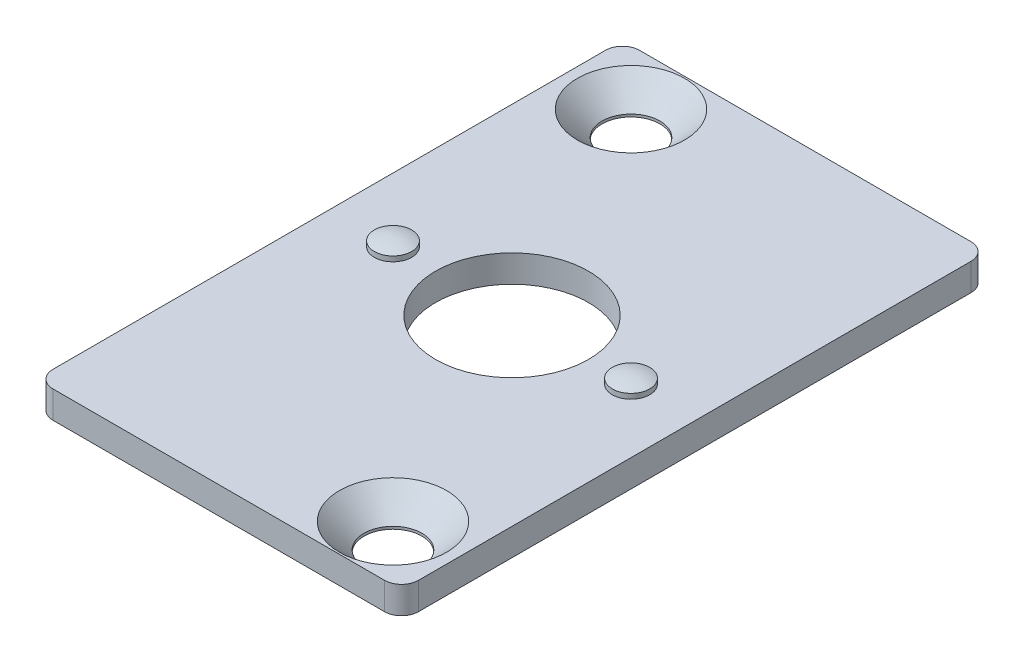
ISO-10303-21;
HEADER;
FILE_DESCRIPTION(('STEP AP214'),'2;1');
FILE_NAME('part.step','',(''),(''),'','','');
FILE_SCHEMA(('AUTOMOTIVE_DESIGN { 1 0 10303 214 1 1 1 1 }'));
ENDSEC;
DATA;
#1=APPLICATION_CONTEXT('core data for automotive mechanical design processes');
#2=APPLICATION_PROTOCOL_DEFINITION('international standard','automotive_design',2000,#1);
#3=PRODUCT_CONTEXT('',#1,'mechanical');
#4=PRODUCT('Part','Part','',(#3));
#5=PRODUCT_RELATED_PRODUCT_CATEGORY('part','',(#4));
#6=PRODUCT_DEFINITION_FORMATION('','',#4);
#7=PRODUCT_DEFINITION_CONTEXT('part definition',#1,'design');
#8=PRODUCT_DEFINITION('design','',#6,#7);
#9=PRODUCT_DEFINITION_SHAPE('','',#8);
#10=(LENGTH_UNIT() NAMED_UNIT(*) SI_UNIT(.MILLI.,.METRE.));
#11=(NAMED_UNIT(*) PLANE_ANGLE_UNIT() SI_UNIT($,.RADIAN.));
#12=(NAMED_UNIT(*) SI_UNIT($,.STERADIAN.) SOLID_ANGLE_UNIT());
#13=UNCERTAINTY_MEASURE_WITH_UNIT(LENGTH_MEASURE(1.E-05),#10,'distance_accuracy_value','');
#14=(GEOMETRIC_REPRESENTATION_CONTEXT(3) GLOBAL_UNCERTAINTY_ASSIGNED_CONTEXT((#13)) GLOBAL_UNIT_ASSIGNED_CONTEXT((#10,
#11,#12)) REPRESENTATION_CONTEXT('',''));
#15=CARTESIAN_POINT('',(0.,0.,0.));
#16=DIRECTION('',(0.,0.,1.));
#17=DIRECTION('',(1.,0.,0.));
#18=AXIS2_PLACEMENT_3D('',#15,#16,#17);
#19=CARTESIAN_POINT('',(10.75,-1.6,-17.25));
#20=DIRECTION('',(1.,0.,0.));
#21=DIRECTION('',(0.,0.,-1.));
#22=AXIS2_PLACEMENT_3D('',#19,#20,#21);
#23=PLANE('',#22);
#24=DIRECTION('',(0.,0.,-1.));
#25=VECTOR('',#24,1.);
#26=CARTESIAN_POINT('',(10.75,-1.6,-17.25));
#27=LINE('',#26,#25);
#28=CARTESIAN_POINT('',(10.75,-1.6,16.25));
#29=VERTEX_POINT('',#28);
#30=CARTESIAN_POINT('',(10.75,-1.6,-16.25));
#31=VERTEX_POINT('',#30);
#32=EDGE_CURVE('E155',#29,#31,#27,.T.);
#33=ORIENTED_EDGE('',*,*,#32,.T.);
#34=DIRECTION('',(0.,1.,0.));
#35=VECTOR('',#34,1.);
#36=CARTESIAN_POINT('',(10.75,-1.6,-16.25));
#37=LINE('',#36,#35);
#38=CARTESIAN_POINT('',(10.75,0.,-16.25));
#39=VERTEX_POINT('',#38);
#40=EDGE_CURVE('E151',#31,#39,#37,.T.);
#41=ORIENTED_EDGE('',*,*,#40,.T.);
#42=DIRECTION('',(0.,0.,-1.));
#43=VECTOR('',#42,1.);
#44=CARTESIAN_POINT('',(10.75,0.,-17.25));
#45=LINE('',#44,#43);
#46=CARTESIAN_POINT('',(10.75,0.,16.25));
#47=VERTEX_POINT('',#46);
#48=EDGE_CURVE('E104',#47,#39,#45,.T.);
#49=ORIENTED_EDGE('',*,*,#48,.F.);
#50=DIRECTION('',(0.,1.,0.));
#51=VECTOR('',#50,1.);
#52=CARTESIAN_POINT('',(10.75,-1.6,16.25));
#53=LINE('',#52,#51);
#54=EDGE_CURVE('E149',#47,#29,#53,.F.);
#55=ORIENTED_EDGE('',*,*,#54,.T.);
#56=EDGE_LOOP('',(#33,#41,#49,#55));
#57=FACE_BOUND('',#56,.T.);
#58=ADVANCED_FACE('F33',(#57),#23,.T.);
#59=CARTESIAN_POINT('',(-10.75,-1.6,17.25));
#60=DIRECTION('',(0.,0.,1.));
#61=DIRECTION('',(1.,0.,0.));
#62=AXIS2_PLACEMENT_3D('',#59,#60,#61);
#63=PLANE('',#62);
#64=DIRECTION('',(1.,0.,0.));
#65=VECTOR('',#64,1.);
#66=CARTESIAN_POINT('',(-10.75,-1.6,17.25));
#67=LINE('',#66,#65);
#68=CARTESIAN_POINT('',(-9.75,-1.6,17.25));
#69=VERTEX_POINT('',#68);
#70=CARTESIAN_POINT('',(9.75,-1.6,17.25));
#71=VERTEX_POINT('',#70);
#72=EDGE_CURVE('E130',#69,#71,#67,.T.);
#73=ORIENTED_EDGE('',*,*,#72,.T.);
#74=DIRECTION('',(0.,1.,0.));
#75=VECTOR('',#74,1.);
#76=CARTESIAN_POINT('',(9.75,-1.6,17.25));
#77=LINE('',#76,#75);
#78=CARTESIAN_POINT('',(9.75,0.,17.25));
#79=VERTEX_POINT('',#78);
#80=EDGE_CURVE('E11',#71,#79,#77,.T.);
#81=ORIENTED_EDGE('',*,*,#80,.T.);
#82=DIRECTION('',(1.,0.,0.));
#83=VECTOR('',#82,1.);
#84=CARTESIAN_POINT('',(-10.75,0.,17.25));
#85=LINE('',#84,#83);
#86=CARTESIAN_POINT('',(-9.75,0.,17.25));
#87=VERTEX_POINT('',#86);
#88=EDGE_CURVE('E157',#87,#79,#85,.T.);
#89=ORIENTED_EDGE('',*,*,#88,.F.);
#90=DIRECTION('',(0.,1.,0.));
#91=VECTOR('',#90,1.);
#92=CARTESIAN_POINT('',(-9.75,-1.6,17.25));
#93=LINE('',#92,#91);
#94=EDGE_CURVE('E41',#87,#69,#93,.F.);
#95=ORIENTED_EDGE('',*,*,#94,.T.);
#96=EDGE_LOOP('',(#73,#81,#89,#95));
#97=FACE_BOUND('',#96,.T.);
#98=ADVANCED_FACE('F228',(#97),#63,.T.);
#99=CARTESIAN_POINT('',(-10.75,-1.6,-17.25));
#100=DIRECTION('',(-1.,0.,0.));
#101=DIRECTION('',(0.,0.,1.));
#102=AXIS2_PLACEMENT_3D('',#99,#100,#101);
#103=PLANE('',#102);
#104=DIRECTION('',(0.,0.,1.));
#105=VECTOR('',#104,1.);
#106=CARTESIAN_POINT('',(-10.75,0.,-17.25));
#107=LINE('',#106,#105);
#108=CARTESIAN_POINT('',(-10.75,0.,-16.25));
#109=VERTEX_POINT('',#108);
#110=CARTESIAN_POINT('',(-10.75,0.,16.25));
#111=VERTEX_POINT('',#110);
#112=EDGE_CURVE('E120',#109,#111,#107,.T.);
#113=ORIENTED_EDGE('',*,*,#112,.F.);
#114=DIRECTION('',(0.,1.,0.));
#115=VECTOR('',#114,1.);
#116=CARTESIAN_POINT('',(-10.75,-1.6,-16.25));
#117=LINE('',#116,#115);
#118=CARTESIAN_POINT('',(-10.75,-1.6,-16.25));
#119=VERTEX_POINT('',#118);
#120=EDGE_CURVE('E141',#109,#119,#117,.F.);
#121=ORIENTED_EDGE('',*,*,#120,.T.);
#122=DIRECTION('',(0.,0.,1.));
#123=VECTOR('',#122,1.);
#124=CARTESIAN_POINT('',(-10.75,-1.6,-17.25));
#125=LINE('',#124,#123);
#126=CARTESIAN_POINT('',(-10.75,-1.6,16.25));
#127=VERTEX_POINT('',#126);
#128=EDGE_CURVE('E159',#119,#127,#125,.T.);
#129=ORIENTED_EDGE('',*,*,#128,.T.);
#130=DIRECTION('',(0.,1.,0.));
#131=VECTOR('',#130,1.);
#132=CARTESIAN_POINT('',(-10.75,-1.6,16.25));
#133=LINE('',#132,#131);
#134=EDGE_CURVE('E138',#127,#111,#133,.T.);
#135=ORIENTED_EDGE('',*,*,#134,.T.);
#136=EDGE_LOOP('',(#113,#121,#129,#135));
#137=FACE_BOUND('',#136,.T.);
#138=ADVANCED_FACE('F233',(#137),#103,.T.);
#139=CARTESIAN_POINT('',(-10.75,-1.6,-17.25));
#140=DIRECTION('',(0.,0.,-1.));
#141=DIRECTION('',(-1.,0.,0.));
#142=AXIS2_PLACEMENT_3D('',#139,#140,#141);
#143=PLANE('',#142);
#144=DIRECTION('',(-1.,0.,0.));
#145=VECTOR('',#144,1.);
#146=CARTESIAN_POINT('',(-10.75,-1.6,-17.25));
#147=LINE('',#146,#145);
#148=CARTESIAN_POINT('',(9.75,-1.6,-17.25));
#149=VERTEX_POINT('',#148);
#150=CARTESIAN_POINT('',(-9.75,-1.6,-17.25));
#151=VERTEX_POINT('',#150);
#152=EDGE_CURVE('E156',#149,#151,#147,.T.);
#153=ORIENTED_EDGE('',*,*,#152,.T.);
#154=DIRECTION('',(0.,1.,0.));
#155=VECTOR('',#154,1.);
#156=CARTESIAN_POINT('',(-9.75,-1.6,-17.25));
#157=LINE('',#156,#155);
#158=CARTESIAN_POINT('',(-9.75,0.,-17.25));
#159=VERTEX_POINT('',#158);
#160=EDGE_CURVE('E119',#151,#159,#157,.T.);
#161=ORIENTED_EDGE('',*,*,#160,.T.);
#162=DIRECTION('',(-1.,0.,0.));
#163=VECTOR('',#162,1.);
#164=CARTESIAN_POINT('',(-10.75,0.,-17.25));
#165=LINE('',#164,#163);
#166=CARTESIAN_POINT('',(9.75,0.,-17.25));
#167=VERTEX_POINT('',#166);
#168=EDGE_CURVE('E102',#167,#159,#165,.T.);
#169=ORIENTED_EDGE('',*,*,#168,.F.);
#170=DIRECTION('',(0.,1.,0.));
#171=VECTOR('',#170,1.);
#172=CARTESIAN_POINT('',(9.75,-1.6,-17.25));
#173=LINE('',#172,#171);
#174=EDGE_CURVE('E116',#167,#149,#173,.F.);
#175=ORIENTED_EDGE('',*,*,#174,.T.);
#176=EDGE_LOOP('',(#153,#161,#169,#175));
#177=FACE_BOUND('',#176,.T.);
#178=ADVANCED_FACE('F115',(#177),#143,.T.);
#179=CARTESIAN_POINT('',(0.,-1.6,0.));
#180=DIRECTION('',(0.,1.,0.));
#181=DIRECTION('',(0.,0.,1.));
#182=AXIS2_PLACEMENT_3D('',#179,#180,#181);
#183=PLANE('',#182);
#184=CARTESIAN_POINT('',(-7.,-1.6,0.));
#185=DIRECTION('',(0.,-1.,0.));
#186=DIRECTION('',(0.,0.,-1.));
#187=AXIS2_PLACEMENT_3D('',#184,#185,#186);
#188=CIRCLE('',#187,1.1);
#189=CARTESIAN_POINT('',(-7.,-1.6,-1.1));
#190=VERTEX_POINT('',#189);
#191=EDGE_CURVE('E454',#190,#190,#188,.T.);
#192=ORIENTED_EDGE('',*,*,#191,.F.);
#193=EDGE_LOOP('',(#192));
#194=FACE_BOUND('',#193,.T.);
#195=CARTESIAN_POINT('',(7.,-1.6,0.));
#196=DIRECTION('',(0.,-1.,0.));
#197=DIRECTION('',(0.,0.,-1.));
#198=AXIS2_PLACEMENT_3D('',#195,#196,#197);
#199=CIRCLE('',#198,1.1);
#200=CARTESIAN_POINT('',(7.,-1.6,-1.1));
#201=VERTEX_POINT('',#200);
#202=EDGE_CURVE('E198',#201,#201,#199,.T.);
#203=ORIENTED_EDGE('',*,*,#202,.F.);
#204=EDGE_LOOP('',(#203));
#205=FACE_BOUND('',#204,.T.);
#206=CARTESIAN_POINT('',(0.,-1.6,0.));
#207=DIRECTION('',(0.,1.,0.));
#208=DIRECTION('',(0.,0.,1.));
#209=AXIS2_PLACEMENT_3D('',#206,#207,#208);
#210=CIRCLE('',#209,4.5);
#211=CARTESIAN_POINT('',(0.,-1.6,4.5));
#212=VERTEX_POINT('',#211);
#213=EDGE_CURVE('E188',#212,#212,#210,.T.);
#214=ORIENTED_EDGE('',*,*,#213,.T.);
#215=EDGE_LOOP('',(#214));
#216=FACE_BOUND('',#215,.T.);
#217=CARTESIAN_POINT('',(-7.,-1.6,-14.));
#218=DIRECTION('',(0.,1.,0.));
#219=DIRECTION('',(0.,0.,1.));
#220=AXIS2_PLACEMENT_3D('',#217,#218,#219);
#221=CIRCLE('',#220,1.7);
#222=CARTESIAN_POINT('',(-7.,-1.6,-12.3));
#223=VERTEX_POINT('',#222);
#224=EDGE_CURVE('E176',#223,#223,#221,.T.);
#225=ORIENTED_EDGE('',*,*,#224,.T.);
#226=EDGE_LOOP('',(#225));
#227=FACE_BOUND('',#226,.T.);
#228=CARTESIAN_POINT('',(7.,-1.6,14.));
#229=DIRECTION('',(0.,1.,0.));
#230=DIRECTION('',(0.,0.,1.));
#231=AXIS2_PLACEMENT_3D('',#228,#229,#230);
#232=CIRCLE('',#231,1.7);
#233=CARTESIAN_POINT('',(7.,-1.6,15.7));
#234=VERTEX_POINT('',#233);
#235=EDGE_CURVE('E170',#234,#234,#232,.T.);
#236=ORIENTED_EDGE('',*,*,#235,.T.);
#237=EDGE_LOOP('',(#236));
#238=FACE_BOUND('',#237,.T.);
#239=ORIENTED_EDGE('',*,*,#128,.F.);
#240=CARTESIAN_POINT('',(-9.75,-1.6,-16.25));
#241=DIRECTION('',(0.,1.,0.));
#242=DIRECTION('',(0.,0.,1.));
#243=AXIS2_PLACEMENT_3D('',#240,#241,#242);
#244=CIRCLE('',#243,1.);
#245=EDGE_CURVE('E147',#119,#151,#244,.F.);
#246=ORIENTED_EDGE('',*,*,#245,.T.);
#247=ORIENTED_EDGE('',*,*,#152,.F.);
#248=CARTESIAN_POINT('',(9.75,-1.6,-16.25));
#249=DIRECTION('',(0.,1.,0.));
#250=DIRECTION('',(0.,0.,1.));
#251=AXIS2_PLACEMENT_3D('',#248,#249,#250);
#252=CIRCLE('',#251,1.);
#253=EDGE_CURVE('E124',#149,#31,#252,.F.);
#254=ORIENTED_EDGE('',*,*,#253,.T.);
#255=ORIENTED_EDGE('',*,*,#32,.F.);
#256=CARTESIAN_POINT('',(9.75,-1.6,16.25));
#257=DIRECTION('',(0.,1.,0.));
#258=DIRECTION('',(0.,0.,1.));
#259=AXIS2_PLACEMENT_3D('',#256,#257,#258);
#260=CIRCLE('',#259,1.);
#261=EDGE_CURVE('E48',#29,#71,#260,.F.);
#262=ORIENTED_EDGE('',*,*,#261,.T.);
#263=ORIENTED_EDGE('',*,*,#72,.F.);
#264=CARTESIAN_POINT('',(-9.75,-1.6,16.25));
#265=DIRECTION('',(0.,1.,0.));
#266=DIRECTION('',(0.,0.,1.));
#267=AXIS2_PLACEMENT_3D('',#264,#265,#266);
#268=CIRCLE('',#267,1.);
#269=EDGE_CURVE('E143',#69,#127,#268,.F.);
#270=ORIENTED_EDGE('',*,*,#269,.T.);
#271=EDGE_LOOP('',(#239,#246,#247,#254,#255,#262,#263,#270));
#272=FACE_BOUND('',#271,.T.);
#273=ADVANCED_FACE('F269',(#194,#205,#216,#227,#238,#272),#183,.F.);
#274=CARTESIAN_POINT('',(0.,0.,0.));
#275=DIRECTION('',(0.,1.,0.));
#276=DIRECTION('',(0.,0.,1.));
#277=AXIS2_PLACEMENT_3D('',#274,#275,#276);
#278=PLANE('',#277);
#279=CARTESIAN_POINT('',(7.,0.,0.));
#280=DIRECTION('',(0.,1.,0.));
#281=DIRECTION('',(0.,0.,1.));
#282=AXIS2_PLACEMENT_3D('',#279,#280,#281);
#283=CIRCLE('',#282,1.1);
#284=CARTESIAN_POINT('',(7.,0.,1.1));
#285=VERTEX_POINT('',#284);
#286=EDGE_CURVE('E125',#285,#285,#283,.T.);
#287=ORIENTED_EDGE('',*,*,#286,.F.);
#288=EDGE_LOOP('',(#287));
#289=FACE_BOUND('',#288,.T.);
#290=CARTESIAN_POINT('',(-7.,0.,0.));
#291=DIRECTION('',(0.,1.,0.));
#292=DIRECTION('',(0.,0.,1.));
#293=AXIS2_PLACEMENT_3D('',#290,#291,#292);
#294=CIRCLE('',#293,1.1);
#295=CARTESIAN_POINT('',(-7.,0.,1.1));
#296=VERTEX_POINT('',#295);
#297=EDGE_CURVE('E184',#296,#296,#294,.T.);
#298=ORIENTED_EDGE('',*,*,#297,.F.);
#299=EDGE_LOOP('',(#298));
#300=FACE_BOUND('',#299,.T.);
#301=CARTESIAN_POINT('',(0.,0.,0.));
#302=DIRECTION('',(0.,1.,0.));
#303=DIRECTION('',(0.,0.,1.));
#304=AXIS2_PLACEMENT_3D('',#301,#302,#303);
#305=CIRCLE('',#304,4.5);
#306=CARTESIAN_POINT('',(0.,0.,4.5));
#307=VERTEX_POINT('',#306);
#308=EDGE_CURVE('E183',#307,#307,#305,.T.);
#309=ORIENTED_EDGE('',*,*,#308,.F.);
#310=EDGE_LOOP('',(#309));
#311=FACE_BOUND('',#310,.T.);
#312=CARTESIAN_POINT('',(-7.,0.,-14.));
#313=DIRECTION('',(0.,1.,0.));
#314=DIRECTION('',(0.,0.,1.));
#315=AXIS2_PLACEMENT_3D('',#312,#313,#314);
#316=CIRCLE('',#315,3.15);
#317=CARTESIAN_POINT('',(-7.,0.,-10.85));
#318=VERTEX_POINT('',#317);
#319=EDGE_CURVE('E201',#318,#318,#316,.T.);
#320=ORIENTED_EDGE('',*,*,#319,.F.);
#321=EDGE_LOOP('',(#320));
#322=FACE_BOUND('',#321,.T.);
#323=CARTESIAN_POINT('',(7.,0.,14.));
#324=DIRECTION('',(0.,1.,0.));
#325=DIRECTION('',(0.,0.,1.));
#326=AXIS2_PLACEMENT_3D('',#323,#324,#325);
#327=CIRCLE('',#326,3.15);
#328=CARTESIAN_POINT('',(7.,0.,17.15));
#329=VERTEX_POINT('',#328);
#330=EDGE_CURVE('E179',#329,#329,#327,.T.);
#331=ORIENTED_EDGE('',*,*,#330,.F.);
#332=EDGE_LOOP('',(#331));
#333=FACE_BOUND('',#332,.T.);
#334=ORIENTED_EDGE('',*,*,#168,.T.);
#335=CARTESIAN_POINT('',(-9.75,0.,-16.25));
#336=DIRECTION('',(0.,1.,0.));
#337=DIRECTION('',(0.,0.,1.));
#338=AXIS2_PLACEMENT_3D('',#335,#336,#337);
#339=CIRCLE('',#338,1.);
#340=EDGE_CURVE('E109',#159,#109,#339,.T.);
#341=ORIENTED_EDGE('',*,*,#340,.T.);
#342=ORIENTED_EDGE('',*,*,#112,.T.);
#343=CARTESIAN_POINT('',(-9.75,0.,16.25));
#344=DIRECTION('',(0.,1.,0.));
#345=DIRECTION('',(0.,0.,1.));
#346=AXIS2_PLACEMENT_3D('',#343,#344,#345);
#347=CIRCLE('',#346,1.);
#348=EDGE_CURVE('E127',#111,#87,#347,.T.);
#349=ORIENTED_EDGE('',*,*,#348,.T.);
#350=ORIENTED_EDGE('',*,*,#88,.T.);
#351=CARTESIAN_POINT('',(9.75,0.,16.25));
#352=DIRECTION('',(0.,1.,0.));
#353=DIRECTION('',(0.,0.,1.));
#354=AXIS2_PLACEMENT_3D('',#351,#352,#353);
#355=CIRCLE('',#354,1.);
#356=EDGE_CURVE('E110',#79,#47,#355,.T.);
#357=ORIENTED_EDGE('',*,*,#356,.T.);
#358=ORIENTED_EDGE('',*,*,#48,.T.);
#359=CARTESIAN_POINT('',(9.75,0.,-16.25));
#360=DIRECTION('',(0.,1.,0.));
#361=DIRECTION('',(0.,0.,1.));
#362=AXIS2_PLACEMENT_3D('',#359,#360,#361);
#363=CIRCLE('',#362,1.);
#364=EDGE_CURVE('E99',#39,#167,#363,.T.);
#365=ORIENTED_EDGE('',*,*,#364,.T.);
#366=EDGE_LOOP('',(#334,#341,#342,#349,#350,#357,#358,#365));
#367=FACE_BOUND('',#366,.T.);
#368=ADVANCED_FACE('F101',(#289,#300,#311,#322,#333,#367),#278,.T.);
#369=CARTESIAN_POINT('',(7.,0.,14.));
#370=DIRECTION('',(0.,1.,0.));
#371=DIRECTION('',(0.,0.,1.));
#372=AXIS2_PLACEMENT_3D('',#369,#370,#371);
#373=CYLINDRICAL_SURFACE('',#372,1.7);
#374=CARTESIAN_POINT('',(7.,-1.45,14.));
#375=DIRECTION('',(0.,1.,0.));
#376=DIRECTION('',(0.,0.,1.));
#377=AXIS2_PLACEMENT_3D('',#374,#375,#376);
#378=CIRCLE('',#377,1.7);
#379=CARTESIAN_POINT('',(7.,-1.45,15.7));
#380=VERTEX_POINT('',#379);
#381=EDGE_CURVE('E164',#380,#380,#378,.T.);
#382=ORIENTED_EDGE('',*,*,#381,.T.);
#383=EDGE_LOOP('',(#382));
#384=FACE_BOUND('',#383,.T.);
#385=ORIENTED_EDGE('',*,*,#235,.F.);
#386=EDGE_LOOP('',(#385));
#387=FACE_BOUND('',#386,.T.);
#388=ADVANCED_FACE('F212',(#384,#387),#373,.F.);
#389=CARTESIAN_POINT('',(7.,0.,14.));
#390=DIRECTION('',(0.,1.,0.));
#391=DIRECTION('',(0.,0.,1.));
#392=AXIS2_PLACEMENT_3D('',#389,#390,#391);
#393=CONICAL_SURFACE('',#392,3.15,0.785398163397448);
#394=ORIENTED_EDGE('',*,*,#381,.F.);
#395=EDGE_LOOP('',(#394));
#396=FACE_BOUND('',#395,.T.);
#397=ORIENTED_EDGE('',*,*,#330,.T.);
#398=EDGE_LOOP('',(#397));
#399=FACE_BOUND('',#398,.T.);
#400=ADVANCED_FACE('F215',(#396,#399),#393,.F.);
#401=CARTESIAN_POINT('',(-7.,0.,-14.));
#402=DIRECTION('',(0.,1.,0.));
#403=DIRECTION('',(0.,0.,1.));
#404=AXIS2_PLACEMENT_3D('',#401,#402,#403);
#405=CYLINDRICAL_SURFACE('',#404,1.7);
#406=CARTESIAN_POINT('',(-7.,-1.45,-14.));
#407=DIRECTION('',(0.,1.,0.));
#408=DIRECTION('',(0.,0.,1.));
#409=AXIS2_PLACEMENT_3D('',#406,#407,#408);
#410=CIRCLE('',#409,1.7);
#411=CARTESIAN_POINT('',(-7.,-1.45,-12.3));
#412=VERTEX_POINT('',#411);
#413=EDGE_CURVE('E180',#412,#412,#410,.T.);
#414=ORIENTED_EDGE('',*,*,#413,.T.);
#415=EDGE_LOOP('',(#414));
#416=FACE_BOUND('',#415,.T.);
#417=ORIENTED_EDGE('',*,*,#224,.F.);
#418=EDGE_LOOP('',(#417));
#419=FACE_BOUND('',#418,.T.);
#420=ADVANCED_FACE('F217',(#416,#419),#405,.F.);
#421=CARTESIAN_POINT('',(-7.,0.,-14.));
#422=DIRECTION('',(0.,1.,0.));
#423=DIRECTION('',(0.,0.,1.));
#424=AXIS2_PLACEMENT_3D('',#421,#422,#423);
#425=CONICAL_SURFACE('',#424,3.15,0.785398163397448);
#426=ORIENTED_EDGE('',*,*,#413,.F.);
#427=EDGE_LOOP('',(#426));
#428=FACE_BOUND('',#427,.T.);
#429=ORIENTED_EDGE('',*,*,#319,.T.);
#430=EDGE_LOOP('',(#429));
#431=FACE_BOUND('',#430,.T.);
#432=ADVANCED_FACE('F223',(#428,#431),#425,.F.);
#433=CARTESIAN_POINT('',(0.,-1.6,0.));
#434=DIRECTION('',(0.,1.,0.));
#435=DIRECTION('',(0.,0.,1.));
#436=AXIS2_PLACEMENT_3D('',#433,#434,#435);
#437=CYLINDRICAL_SURFACE('',#436,4.5);
#438=ORIENTED_EDGE('',*,*,#213,.F.);
#439=EDGE_LOOP('',(#438));
#440=FACE_BOUND('',#439,.T.);
#441=ORIENTED_EDGE('',*,*,#308,.T.);
#442=EDGE_LOOP('',(#441));
#443=FACE_BOUND('',#442,.T.);
#444=ADVANCED_FACE('F376',(#440,#443),#437,.F.);
#445=CARTESIAN_POINT('',(-7.,0.3,0.));
#446=DIRECTION('',(0.,-1.,0.));
#447=DIRECTION('',(0.,0.,-1.));
#448=AXIS2_PLACEMENT_3D('',#445,#446,#447);
#449=CYLINDRICAL_SURFACE('',#448,1.1);
#450=CARTESIAN_POINT('',(-7.,0.3,0.));
#451=DIRECTION('',(0.,1.,0.));
#452=DIRECTION('',(0.,0.,1.));
#453=AXIS2_PLACEMENT_3D('',#450,#451,#452);
#454=CIRCLE('',#453,1.1);
#455=CARTESIAN_POINT('',(-7.,0.3,1.1));
#456=VERTEX_POINT('',#455);
#457=EDGE_CURVE('E181',#456,#456,#454,.T.);
#458=ORIENTED_EDGE('',*,*,#457,.F.);
#459=EDGE_LOOP('',(#458));
#460=FACE_BOUND('',#459,.T.);
#461=ORIENTED_EDGE('',*,*,#297,.T.);
#462=EDGE_LOOP('',(#461));
#463=FACE_BOUND('',#462,.T.);
#464=ADVANCED_FACE('F242',(#460,#463),#449,.T.);
#465=CARTESIAN_POINT('',(-7.,-2.625,0.));
#466=DIRECTION('',(0.,0.,1.));
#467=DIRECTION('',(1.,0.,0.));
#468=AXIS2_PLACEMENT_3D('',#465,#466,#467);
#469=SPHERICAL_SURFACE('',#468,3.125);
#470=CARTESIAN_POINT('',(-7.,-2.625,0.));
#471=DIRECTION('',(0.,1.,0.));
#472=DIRECTION('',(0.,0.,1.));
#473=AXIS2_PLACEMENT_3D('',#470,#471,#472);
#474=SPHERICAL_SURFACE('',#473,3.125);
#475=ORIENTED_EDGE('',*,*,#457,.T.);
#476=EDGE_LOOP('',(#475));
#477=FACE_BOUND('',#476,.T.);
#478=ADVANCED_FACE('F238',(#477),#474,.T.);
#479=CARTESIAN_POINT('',(7.,0.3,0.));
#480=DIRECTION('',(0.,-1.,0.));
#481=DIRECTION('',(0.,0.,-1.));
#482=AXIS2_PLACEMENT_3D('',#479,#480,#481);
#483=CYLINDRICAL_SURFACE('',#482,1.1);
#484=CARTESIAN_POINT('',(7.,0.3,0.));
#485=DIRECTION('',(0.,-1.,0.));
#486=DIRECTION('',(0.,0.,1.));
#487=AXIS2_PLACEMENT_3D('',#484,#485,#486);
#488=CIRCLE('',#487,1.1);
#489=CARTESIAN_POINT('',(7.,0.3,1.1));
#490=VERTEX_POINT('',#489);
#491=EDGE_CURVE('E133',#490,#490,#488,.T.);
#492=ORIENTED_EDGE('',*,*,#491,.T.);
#493=EDGE_LOOP('',(#492));
#494=FACE_BOUND('',#493,.T.);
#495=ORIENTED_EDGE('',*,*,#286,.T.);
#496=EDGE_LOOP('',(#495));
#497=FACE_BOUND('',#496,.T.);
#498=ADVANCED_FACE('F241',(#494,#497),#483,.T.);
#499=CARTESIAN_POINT('',(7.,-2.625,0.));
#500=DIRECTION('',(0.,0.,1.));
#501=DIRECTION('',(1.,0.,0.));
#502=AXIS2_PLACEMENT_3D('',#499,#500,#501);
#503=SPHERICAL_SURFACE('',#502,3.125);
#504=CARTESIAN_POINT('',(7.,-2.625,0.));
#505=DIRECTION('',(0.,-1.,0.));
#506=DIRECTION('',(0.,0.,1.));
#507=AXIS2_PLACEMENT_3D('',#504,#505,#506);
#508=SPHERICAL_SURFACE('',#507,3.125);
#509=ORIENTED_EDGE('',*,*,#491,.F.);
#510=EDGE_LOOP('',(#509));
#511=FACE_BOUND('',#510,.T.);
#512=ADVANCED_FACE('F243',(#511),#508,.T.);
#513=CARTESIAN_POINT('',(7.,-1.3,0.));
#514=DIRECTION('',(0.,-1.,0.));
#515=DIRECTION('',(0.,0.,-1.));
#516=AXIS2_PLACEMENT_3D('',#513,#514,#515);
#517=CYLINDRICAL_SURFACE('',#516,1.1);
#518=CARTESIAN_POINT('',(7.,-1.3,0.));
#519=DIRECTION('',(0.,-1.,0.));
#520=DIRECTION('',(0.,0.,-1.));
#521=AXIS2_PLACEMENT_3D('',#518,#519,#520);
#522=CIRCLE('',#521,1.1);
#523=CARTESIAN_POINT('',(7.,-1.3,-1.1));
#524=VERTEX_POINT('',#523);
#525=EDGE_CURVE('E451',#524,#524,#522,.T.);
#526=ORIENTED_EDGE('',*,*,#525,.F.);
#527=EDGE_LOOP('',(#526));
#528=FACE_BOUND('',#527,.T.);
#529=ORIENTED_EDGE('',*,*,#202,.T.);
#530=EDGE_LOOP('',(#529));
#531=FACE_BOUND('',#530,.T.);
#532=ADVANCED_FACE('F246',(#528,#531),#517,.F.);
#533=CARTESIAN_POINT('',(7.,-1.3,0.));
#534=DIRECTION('',(0.,-1.,0.));
#535=DIRECTION('',(0.,0.,-1.));
#536=AXIS2_PLACEMENT_3D('',#533,#534,#535);
#537=PLANE('',#536);
#538=ORIENTED_EDGE('',*,*,#525,.T.);
#539=EDGE_LOOP('',(#538));
#540=FACE_BOUND('',#539,.T.);
#541=ADVANCED_FACE('F339',(#540),#537,.T.);
#542=CARTESIAN_POINT('',(-7.,-1.3,0.));
#543=DIRECTION('',(0.,-1.,0.));
#544=DIRECTION('',(0.,0.,-1.));
#545=AXIS2_PLACEMENT_3D('',#542,#543,#544);
#546=CYLINDRICAL_SURFACE('',#545,1.1);
#547=CARTESIAN_POINT('',(-7.,-1.3,0.));
#548=DIRECTION('',(0.,-1.,0.));
#549=DIRECTION('',(0.,0.,-1.));
#550=AXIS2_PLACEMENT_3D('',#547,#548,#549);
#551=CIRCLE('',#550,1.1);
#552=CARTESIAN_POINT('',(-7.,-1.3,-1.1));
#553=VERTEX_POINT('',#552);
#554=EDGE_CURVE('E195',#553,#553,#551,.T.);
#555=ORIENTED_EDGE('',*,*,#554,.F.);
#556=EDGE_LOOP('',(#555));
#557=FACE_BOUND('',#556,.T.);
#558=ORIENTED_EDGE('',*,*,#191,.T.);
#559=EDGE_LOOP('',(#558));
#560=FACE_BOUND('',#559,.T.);
#561=ADVANCED_FACE('F332',(#557,#560),#546,.F.);
#562=CARTESIAN_POINT('',(-7.,-1.3,0.));
#563=DIRECTION('',(0.,-1.,0.));
#564=DIRECTION('',(0.,0.,-1.));
#565=AXIS2_PLACEMENT_3D('',#562,#563,#564);
#566=PLANE('',#565);
#567=ORIENTED_EDGE('',*,*,#554,.T.);
#568=EDGE_LOOP('',(#567));
#569=FACE_BOUND('',#568,.T.);
#570=ADVANCED_FACE('F251',(#569),#566,.T.);
#571=CARTESIAN_POINT('',(-9.75,-1.6,-16.25));
#572=DIRECTION('',(0.,1.,0.));
#573=DIRECTION('',(0.,0.,1.));
#574=AXIS2_PLACEMENT_3D('',#571,#572,#573);
#575=CYLINDRICAL_SURFACE('',#574,1.);
#576=ORIENTED_EDGE('',*,*,#245,.F.);
#577=ORIENTED_EDGE('',*,*,#120,.F.);
#578=ORIENTED_EDGE('',*,*,#340,.F.);
#579=ORIENTED_EDGE('',*,*,#160,.F.);
#580=EDGE_LOOP('',(#576,#577,#578,#579));
#581=FACE_BOUND('',#580,.T.);
#582=ADVANCED_FACE('F248',(#581),#575,.T.);
#583=CARTESIAN_POINT('',(9.75,-1.6,-16.25));
#584=DIRECTION('',(0.,1.,0.));
#585=DIRECTION('',(0.,0.,1.));
#586=AXIS2_PLACEMENT_3D('',#583,#584,#585);
#587=CYLINDRICAL_SURFACE('',#586,1.);
#588=ORIENTED_EDGE('',*,*,#253,.F.);
#589=ORIENTED_EDGE('',*,*,#174,.F.);
#590=ORIENTED_EDGE('',*,*,#364,.F.);
#591=ORIENTED_EDGE('',*,*,#40,.F.);
#592=EDGE_LOOP('',(#588,#589,#590,#591));
#593=FACE_BOUND('',#592,.T.);
#594=ADVANCED_FACE('F123',(#593),#587,.T.);
#595=CARTESIAN_POINT('',(9.75,-1.6,16.25));
#596=DIRECTION('',(0.,1.,0.));
#597=DIRECTION('',(0.,0.,1.));
#598=AXIS2_PLACEMENT_3D('',#595,#596,#597);
#599=CYLINDRICAL_SURFACE('',#598,1.);
#600=ORIENTED_EDGE('',*,*,#261,.F.);
#601=ORIENTED_EDGE('',*,*,#54,.F.);
#602=ORIENTED_EDGE('',*,*,#356,.F.);
#603=ORIENTED_EDGE('',*,*,#80,.F.);
#604=EDGE_LOOP('',(#600,#601,#602,#603));
#605=FACE_BOUND('',#604,.T.);
#606=ADVANCED_FACE('F254',(#605),#599,.T.);
#607=CARTESIAN_POINT('',(-9.75,-1.6,16.25));
#608=DIRECTION('',(0.,1.,0.));
#609=DIRECTION('',(0.,0.,1.));
#610=AXIS2_PLACEMENT_3D('',#607,#608,#609);
#611=CYLINDRICAL_SURFACE('',#610,1.);
#612=ORIENTED_EDGE('',*,*,#269,.F.);
#613=ORIENTED_EDGE('',*,*,#94,.F.);
#614=ORIENTED_EDGE('',*,*,#348,.F.);
#615=ORIENTED_EDGE('',*,*,#134,.F.);
#616=EDGE_LOOP('',(#612,#613,#614,#615));
#617=FACE_BOUND('',#616,.T.);
#618=ADVANCED_FACE('F35',(#617),#611,.T.);
#619=CLOSED_SHELL('',(#58,#98,#138,#178,#273,#368,#388,#400,#420,#432,#444,#464,#478,#498,#512,
#532,#541,#561,#570,#582,#594,#606,#618));
#620=MANIFOLD_SOLID_BREP('B2',#619);
#621=ADVANCED_BREP_SHAPE_REPRESENTATION('',(#18,#620),#14);
#622=SHAPE_DEFINITION_REPRESENTATION(#9,#621);
ENDSEC;
END-ISO-10303-21;
